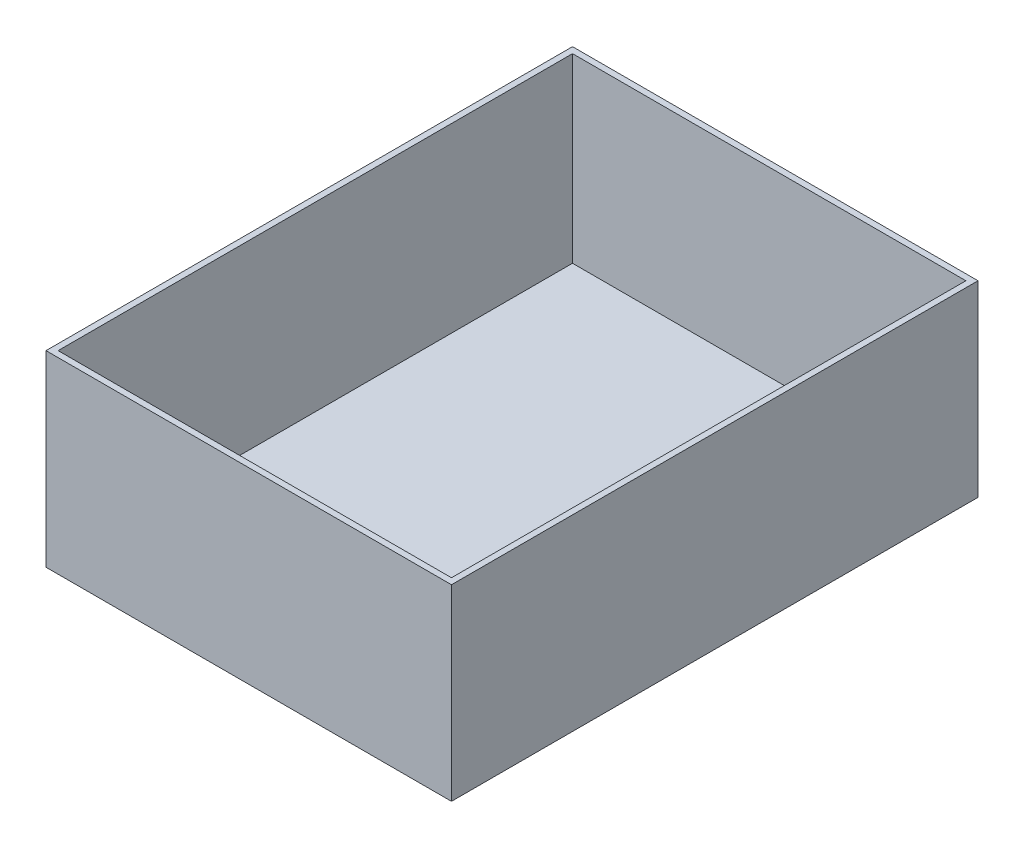
ISO-10303-21;
HEADER;
FILE_DESCRIPTION(('STEP AP214'),'2;1');
FILE_NAME('part.step','',(''),(''),'','','');
FILE_SCHEMA(('AUTOMOTIVE_DESIGN { 1 0 10303 214 1 1 1 1 }'));
ENDSEC;
DATA;
#1=APPLICATION_CONTEXT('core data for automotive mechanical design processes');
#2=APPLICATION_PROTOCOL_DEFINITION('international standard','automotive_design',2000,#1);
#3=PRODUCT_CONTEXT('',#1,'mechanical');
#4=PRODUCT('Part','Part','',(#3));
#5=PRODUCT_RELATED_PRODUCT_CATEGORY('part','',(#4));
#6=PRODUCT_DEFINITION_FORMATION('','',#4);
#7=PRODUCT_DEFINITION_CONTEXT('part definition',#1,'design');
#8=PRODUCT_DEFINITION('design','',#6,#7);
#9=PRODUCT_DEFINITION_SHAPE('','',#8);
#10=(LENGTH_UNIT() NAMED_UNIT(*) SI_UNIT(.MILLI.,.METRE.));
#11=(NAMED_UNIT(*) PLANE_ANGLE_UNIT() SI_UNIT($,.RADIAN.));
#12=(NAMED_UNIT(*) SI_UNIT($,.STERADIAN.) SOLID_ANGLE_UNIT());
#13=UNCERTAINTY_MEASURE_WITH_UNIT(LENGTH_MEASURE(1.E-05),#10,'distance_accuracy_value','');
#14=(GEOMETRIC_REPRESENTATION_CONTEXT(3) GLOBAL_UNCERTAINTY_ASSIGNED_CONTEXT((#13)) GLOBAL_UNIT_ASSIGNED_CONTEXT((#10,
#11,#12)) REPRESENTATION_CONTEXT('',''));
#15=CARTESIAN_POINT('',(0.,0.,0.));
#16=DIRECTION('',(0.,0.,1.));
#17=DIRECTION('',(1.,0.,0.));
#18=AXIS2_PLACEMENT_3D('',#15,#16,#17);
#19=CARTESIAN_POINT('',(155.03787804642,76.2,280.719307320076));
#20=DIRECTION('',(0.,0.,-1.));
#21=DIRECTION('',(-1.,0.,0.));
#22=AXIS2_PLACEMENT_3D('',#19,#20,#21);
#23=PLANE('',#22);
#24=DIRECTION('',(1.,0.,0.));
#25=VECTOR('',#24,1.);
#26=CARTESIAN_POINT('',(155.03787804642,-2.54,280.719307320076));
#27=LINE('',#26,#25);
#28=CARTESIAN_POINT('',(152.49787804642,-2.54,280.719307320076));
#29=VERTEX_POINT('',#28);
#30=CARTESIAN_POINT('',(322.67787804642,-2.54,280.719307320076));
#31=VERTEX_POINT('',#30);
#32=EDGE_CURVE('E122',#29,#31,#27,.T.);
#33=ORIENTED_EDGE('',*,*,#32,.T.);
#34=DIRECTION('',(0.,-1.,0.));
#35=VECTOR('',#34,1.);
#36=CARTESIAN_POINT('',(322.67787804642,76.2,280.719307320076));
#37=LINE('',#36,#35);
#38=CARTESIAN_POINT('',(322.67787804642,76.2,280.719307320076));
#39=VERTEX_POINT('',#38);
#40=EDGE_CURVE('E11',#39,#31,#37,.T.);
#41=ORIENTED_EDGE('',*,*,#40,.F.);
#42=DIRECTION('',(1.,0.,0.));
#43=VECTOR('',#42,1.);
#44=CARTESIAN_POINT('',(155.03787804642,76.2,280.719307320076));
#45=LINE('',#44,#43);
#46=CARTESIAN_POINT('',(152.49787804642,76.2,280.719307320076));
#47=VERTEX_POINT('',#46);
#48=EDGE_CURVE('E159',#47,#39,#45,.T.);
#49=ORIENTED_EDGE('',*,*,#48,.F.);
#50=DIRECTION('',(0.,-1.,0.));
#51=VECTOR('',#50,1.);
#52=CARTESIAN_POINT('',(152.49787804642,76.2,280.719307320076));
#53=LINE('',#52,#51);
#54=EDGE_CURVE('E60',#47,#29,#53,.T.);
#55=ORIENTED_EDGE('',*,*,#54,.T.);
#56=EDGE_LOOP('',(#33,#41,#49,#55));
#57=FACE_BOUND('',#56,.T.);
#58=ADVANCED_FACE('F35',(#57),#23,.F.);
#59=CARTESIAN_POINT('',(322.67787804642,76.2,278.179307320076));
#60=DIRECTION('',(-1.,0.,0.));
#61=DIRECTION('',(0.,0.,1.));
#62=AXIS2_PLACEMENT_3D('',#59,#60,#61);
#63=PLANE('',#62);
#64=DIRECTION('',(0.,0.,-1.));
#65=VECTOR('',#64,1.);
#66=CARTESIAN_POINT('',(322.67787804642,-2.54,278.179307320076));
#67=LINE('',#66,#65);
#68=CARTESIAN_POINT('',(322.67787804642,-2.54,59.7393073200764));
#69=VERTEX_POINT('',#68);
#70=EDGE_CURVE('E145',#31,#69,#67,.T.);
#71=ORIENTED_EDGE('',*,*,#70,.T.);
#72=DIRECTION('',(0.,-1.,0.));
#73=VECTOR('',#72,1.);
#74=CARTESIAN_POINT('',(322.67787804642,76.2,59.7393073200765));
#75=LINE('',#74,#73);
#76=CARTESIAN_POINT('',(322.67787804642,76.2,59.7393073200764));
#77=VERTEX_POINT('',#76);
#78=EDGE_CURVE('E44',#77,#69,#75,.T.);
#79=ORIENTED_EDGE('',*,*,#78,.F.);
#80=DIRECTION('',(0.,0.,-1.));
#81=VECTOR('',#80,1.);
#82=CARTESIAN_POINT('',(322.67787804642,76.2,278.179307320076));
#83=LINE('',#82,#81);
#84=EDGE_CURVE('E162',#39,#77,#83,.T.);
#85=ORIENTED_EDGE('',*,*,#84,.F.);
#86=ORIENTED_EDGE('',*,*,#40,.T.);
#87=EDGE_LOOP('',(#71,#79,#85,#86));
#88=FACE_BOUND('',#87,.T.);
#89=ADVANCED_FACE('F173',(#88),#63,.F.);
#90=CARTESIAN_POINT('',(155.03787804642,76.2,59.7393073200764));
#91=DIRECTION('',(0.,0.,-1.));
#92=DIRECTION('',(-1.,0.,0.));
#93=AXIS2_PLACEMENT_3D('',#90,#91,#92);
#94=PLANE('',#93);
#95=DIRECTION('',(1.,0.,0.));
#96=VECTOR('',#95,1.);
#97=CARTESIAN_POINT('',(155.03787804642,-2.54,59.7393073200764));
#98=LINE('',#97,#96);
#99=CARTESIAN_POINT('',(152.49787804642,-2.54,59.7393073200764));
#100=VERTEX_POINT('',#99);
#101=EDGE_CURVE('E151',#100,#69,#98,.T.);
#102=ORIENTED_EDGE('',*,*,#101,.F.);
#103=DIRECTION('',(0.,-1.,0.));
#104=VECTOR('',#103,1.);
#105=CARTESIAN_POINT('',(152.49787804642,76.2,59.7393073200764));
#106=LINE('',#105,#104);
#107=CARTESIAN_POINT('',(152.49787804642,76.2,59.7393073200764));
#108=VERTEX_POINT('',#107);
#109=EDGE_CURVE('E148',#108,#100,#106,.T.);
#110=ORIENTED_EDGE('',*,*,#109,.F.);
#111=DIRECTION('',(1.,0.,0.));
#112=VECTOR('',#111,1.);
#113=CARTESIAN_POINT('',(155.03787804642,76.2,59.7393073200764));
#114=LINE('',#113,#112);
#115=EDGE_CURVE('E163',#108,#77,#114,.T.);
#116=ORIENTED_EDGE('',*,*,#115,.T.);
#117=ORIENTED_EDGE('',*,*,#78,.T.);
#118=EDGE_LOOP('',(#102,#110,#116,#117));
#119=FACE_BOUND('',#118,.T.);
#120=ADVANCED_FACE('F174',(#119),#94,.T.);
#121=CARTESIAN_POINT('',(152.49787804642,76.2,278.179307320076));
#122=DIRECTION('',(-1.,0.,0.));
#123=DIRECTION('',(0.,0.,1.));
#124=AXIS2_PLACEMENT_3D('',#121,#122,#123);
#125=PLANE('',#124);
#126=DIRECTION('',(0.,0.,-1.));
#127=VECTOR('',#126,1.);
#128=CARTESIAN_POINT('',(152.49787804642,-2.54,278.179307320076));
#129=LINE('',#128,#127);
#130=EDGE_CURVE('E155',#29,#100,#129,.T.);
#131=ORIENTED_EDGE('',*,*,#130,.F.);
#132=ORIENTED_EDGE('',*,*,#54,.F.);
#133=DIRECTION('',(0.,0.,-1.));
#134=VECTOR('',#133,1.);
#135=CARTESIAN_POINT('',(152.49787804642,76.2,278.179307320076));
#136=LINE('',#135,#134);
#137=EDGE_CURVE('E39',#47,#108,#136,.T.);
#138=ORIENTED_EDGE('',*,*,#137,.T.);
#139=ORIENTED_EDGE('',*,*,#109,.T.);
#140=EDGE_LOOP('',(#131,#132,#138,#139));
#141=FACE_BOUND('',#140,.T.);
#142=ADVANCED_FACE('F168',(#141),#125,.T.);
#143=CARTESIAN_POINT('',(0.,76.2,0.));
#144=DIRECTION('',(0.,1.,0.));
#145=DIRECTION('',(0.,0.,1.));
#146=AXIS2_PLACEMENT_3D('',#143,#144,#145);
#147=PLANE('',#146);
#148=DIRECTION('',(1.,0.,0.));
#149=VECTOR('',#148,1.);
#150=CARTESIAN_POINT('',(155.03787804642,76.2,278.179307320076));
#151=LINE('',#150,#149);
#152=CARTESIAN_POINT('',(155.03787804642,76.2,278.179307320076));
#153=VERTEX_POINT('',#152);
#154=CARTESIAN_POINT('',(320.13787804642,76.2,278.179307320076));
#155=VERTEX_POINT('',#154);
#156=EDGE_CURVE('E104',#153,#155,#151,.T.);
#157=ORIENTED_EDGE('',*,*,#156,.F.);
#158=DIRECTION('',(0.,0.,-1.));
#159=VECTOR('',#158,1.);
#160=CARTESIAN_POINT('',(155.03787804642,76.2,278.179307320076));
#161=LINE('',#160,#159);
#162=CARTESIAN_POINT('',(155.03787804642,76.2,62.2793073200764));
#163=VERTEX_POINT('',#162);
#164=EDGE_CURVE('E128',#153,#163,#161,.T.);
#165=ORIENTED_EDGE('',*,*,#164,.T.);
#166=DIRECTION('',(1.,0.,0.));
#167=VECTOR('',#166,1.);
#168=CARTESIAN_POINT('',(155.03787804642,76.2,62.2793073200764));
#169=LINE('',#168,#167);
#170=CARTESIAN_POINT('',(320.13787804642,76.2,62.2793073200764));
#171=VERTEX_POINT('',#170);
#172=EDGE_CURVE('E52',#163,#171,#169,.T.);
#173=ORIENTED_EDGE('',*,*,#172,.T.);
#174=DIRECTION('',(0.,0.,-1.));
#175=VECTOR('',#174,1.);
#176=CARTESIAN_POINT('',(320.13787804642,76.2,278.179307320076));
#177=LINE('',#176,#175);
#178=EDGE_CURVE('E115',#155,#171,#177,.T.);
#179=ORIENTED_EDGE('',*,*,#178,.F.);
#180=EDGE_LOOP('',(#157,#165,#173,#179));
#181=FACE_BOUND('',#180,.T.);
#182=ORIENTED_EDGE('',*,*,#48,.T.);
#183=ORIENTED_EDGE('',*,*,#84,.T.);
#184=ORIENTED_EDGE('',*,*,#115,.F.);
#185=ORIENTED_EDGE('',*,*,#137,.F.);
#186=EDGE_LOOP('',(#182,#183,#184,#185));
#187=FACE_BOUND('',#186,.T.);
#188=ADVANCED_FACE('F125',(#181,#187),#147,.T.);
#189=CARTESIAN_POINT('',(0.,-2.54,0.));
#190=DIRECTION('',(0.,1.,0.));
#191=DIRECTION('',(0.,0.,1.));
#192=AXIS2_PLACEMENT_3D('',#189,#190,#191);
#193=PLANE('',#192);
#194=ORIENTED_EDGE('',*,*,#32,.F.);
#195=ORIENTED_EDGE('',*,*,#130,.T.);
#196=ORIENTED_EDGE('',*,*,#101,.T.);
#197=ORIENTED_EDGE('',*,*,#70,.F.);
#198=EDGE_LOOP('',(#194,#195,#196,#197));
#199=FACE_BOUND('',#198,.T.);
#200=ADVANCED_FACE('F37',(#199),#193,.F.);
#201=CARTESIAN_POINT('',(155.03787804642,76.2,278.179307320076));
#202=DIRECTION('',(0.,0.,-1.));
#203=DIRECTION('',(-1.,0.,0.));
#204=AXIS2_PLACEMENT_3D('',#201,#202,#203);
#205=PLANE('',#204);
#206=DIRECTION('',(1.,0.,0.));
#207=VECTOR('',#206,1.);
#208=CARTESIAN_POINT('',(155.03787804642,0.,278.179307320076));
#209=LINE('',#208,#207);
#210=CARTESIAN_POINT('',(155.03787804642,0.,278.179307320076));
#211=VERTEX_POINT('',#210);
#212=CARTESIAN_POINT('',(320.13787804642,0.,278.179307320076));
#213=VERTEX_POINT('',#212);
#214=EDGE_CURVE('E132',#211,#213,#209,.T.);
#215=ORIENTED_EDGE('',*,*,#214,.F.);
#216=DIRECTION('',(0.,-1.,0.));
#217=VECTOR('',#216,1.);
#218=CARTESIAN_POINT('',(155.03787804642,76.2,278.179307320076));
#219=LINE('',#218,#217);
#220=EDGE_CURVE('E110',#153,#211,#219,.T.);
#221=ORIENTED_EDGE('',*,*,#220,.F.);
#222=ORIENTED_EDGE('',*,*,#156,.T.);
#223=DIRECTION('',(0.,-1.,0.));
#224=VECTOR('',#223,1.);
#225=CARTESIAN_POINT('',(320.13787804642,76.2,278.179307320076));
#226=LINE('',#225,#224);
#227=EDGE_CURVE('E108',#155,#213,#226,.T.);
#228=ORIENTED_EDGE('',*,*,#227,.T.);
#229=EDGE_LOOP('',(#215,#221,#222,#228));
#230=FACE_BOUND('',#229,.T.);
#231=ADVANCED_FACE('F107',(#230),#205,.T.);
#232=CARTESIAN_POINT('',(320.13787804642,76.2,278.179307320076));
#233=DIRECTION('',(-1.,0.,0.));
#234=DIRECTION('',(0.,0.,1.));
#235=AXIS2_PLACEMENT_3D('',#232,#233,#234);
#236=PLANE('',#235);
#237=DIRECTION('',(0.,0.,-1.));
#238=VECTOR('',#237,1.);
#239=CARTESIAN_POINT('',(320.13787804642,0.,278.179307320076));
#240=LINE('',#239,#238);
#241=CARTESIAN_POINT('',(320.13787804642,0.,62.2793073200764));
#242=VERTEX_POINT('',#241);
#243=EDGE_CURVE('E121',#213,#242,#240,.T.);
#244=ORIENTED_EDGE('',*,*,#243,.F.);
#245=ORIENTED_EDGE('',*,*,#227,.F.);
#246=ORIENTED_EDGE('',*,*,#178,.T.);
#247=DIRECTION('',(0.,-1.,0.));
#248=VECTOR('',#247,1.);
#249=CARTESIAN_POINT('',(320.13787804642,76.2,62.2793073200764));
#250=LINE('',#249,#248);
#251=EDGE_CURVE('E123',#171,#242,#250,.T.);
#252=ORIENTED_EDGE('',*,*,#251,.T.);
#253=EDGE_LOOP('',(#244,#245,#246,#252));
#254=FACE_BOUND('',#253,.T.);
#255=ADVANCED_FACE('F119',(#254),#236,.T.);
#256=CARTESIAN_POINT('',(155.03787804642,76.2,62.2793073200764));
#257=DIRECTION('',(0.,0.,-1.));
#258=DIRECTION('',(-1.,0.,0.));
#259=AXIS2_PLACEMENT_3D('',#256,#257,#258);
#260=PLANE('',#259);
#261=DIRECTION('',(1.,0.,0.));
#262=VECTOR('',#261,1.);
#263=CARTESIAN_POINT('',(155.03787804642,0.,62.2793073200764));
#264=LINE('',#263,#262);
#265=CARTESIAN_POINT('',(155.03787804642,0.,62.2793073200764));
#266=VERTEX_POINT('',#265);
#267=EDGE_CURVE('E135',#266,#242,#264,.T.);
#268=ORIENTED_EDGE('',*,*,#267,.T.);
#269=ORIENTED_EDGE('',*,*,#251,.F.);
#270=ORIENTED_EDGE('',*,*,#172,.F.);
#271=DIRECTION('',(0.,-1.,0.));
#272=VECTOR('',#271,1.);
#273=CARTESIAN_POINT('',(155.03787804642,76.2,62.2793073200764));
#274=LINE('',#273,#272);
#275=EDGE_CURVE('E141',#163,#266,#274,.T.);
#276=ORIENTED_EDGE('',*,*,#275,.T.);
#277=EDGE_LOOP('',(#268,#269,#270,#276));
#278=FACE_BOUND('',#277,.T.);
#279=ADVANCED_FACE('F201',(#278),#260,.F.);
#280=CARTESIAN_POINT('',(155.03787804642,76.2,278.179307320076));
#281=DIRECTION('',(-1.,0.,0.));
#282=DIRECTION('',(0.,0.,1.));
#283=AXIS2_PLACEMENT_3D('',#280,#281,#282);
#284=PLANE('',#283);
#285=DIRECTION('',(0.,0.,-1.));
#286=VECTOR('',#285,1.);
#287=CARTESIAN_POINT('',(155.03787804642,0.,278.179307320076));
#288=LINE('',#287,#286);
#289=EDGE_CURVE('E116',#211,#266,#288,.T.);
#290=ORIENTED_EDGE('',*,*,#289,.T.);
#291=ORIENTED_EDGE('',*,*,#275,.F.);
#292=ORIENTED_EDGE('',*,*,#164,.F.);
#293=ORIENTED_EDGE('',*,*,#220,.T.);
#294=EDGE_LOOP('',(#290,#291,#292,#293));
#295=FACE_BOUND('',#294,.T.);
#296=ADVANCED_FACE('F206',(#295),#284,.F.);
#297=CARTESIAN_POINT('',(0.,0.,0.));
#298=DIRECTION('',(0.,1.,0.));
#299=DIRECTION('',(0.,0.,1.));
#300=AXIS2_PLACEMENT_3D('',#297,#298,#299);
#301=PLANE('',#300);
#302=ORIENTED_EDGE('',*,*,#214,.T.);
#303=ORIENTED_EDGE('',*,*,#243,.T.);
#304=ORIENTED_EDGE('',*,*,#267,.F.);
#305=ORIENTED_EDGE('',*,*,#289,.F.);
#306=EDGE_LOOP('',(#302,#303,#304,#305));
#307=FACE_BOUND('',#306,.T.);
#308=ADVANCED_FACE('F209',(#307),#301,.T.);
#309=CLOSED_SHELL('',(#58,#89,#120,#142,#188,#200,#231,#255,#279,#296,#308));
#310=MANIFOLD_SOLID_BREP('B2',#309);
#311=ADVANCED_BREP_SHAPE_REPRESENTATION('',(#18,#310),#14);
#312=SHAPE_DEFINITION_REPRESENTATION(#9,#311);
ENDSEC;
END-ISO-10303-21;
